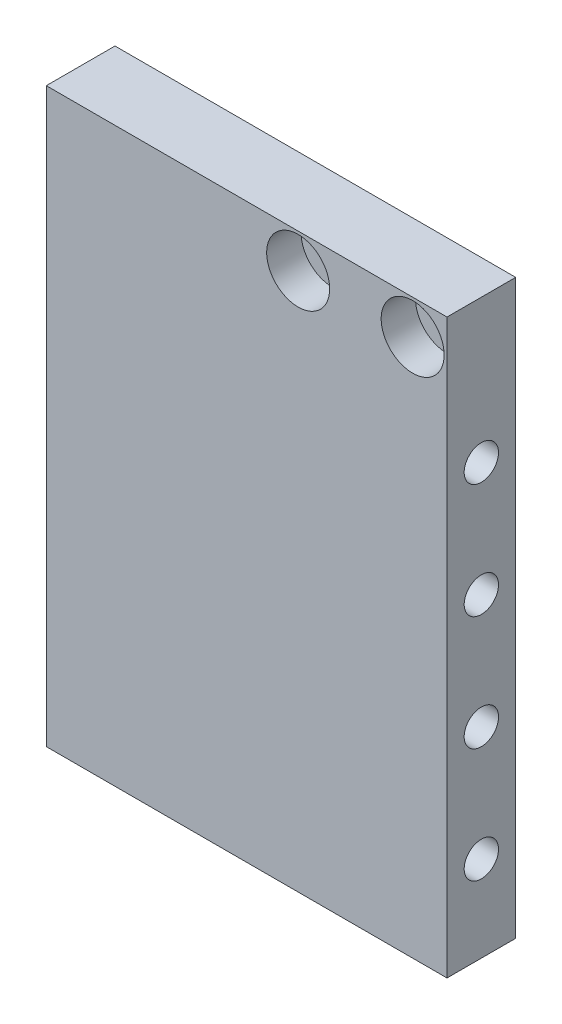
ISO-10303-21;
HEADER;
FILE_DESCRIPTION(('STEP AP214'),'2;1');
FILE_NAME('part.step','',(''),(''),'','','');
FILE_SCHEMA(('AUTOMOTIVE_DESIGN { 1 0 10303 214 1 1 1 1 }'));
ENDSEC;
DATA;
#1=APPLICATION_CONTEXT('core data for automotive mechanical design processes');
#2=APPLICATION_PROTOCOL_DEFINITION('international standard','automotive_design',2000,#1);
#3=PRODUCT_CONTEXT('',#1,'mechanical');
#4=PRODUCT('Part','Part','',(#3));
#5=PRODUCT_RELATED_PRODUCT_CATEGORY('part','',(#4));
#6=PRODUCT_DEFINITION_FORMATION('','',#4);
#7=PRODUCT_DEFINITION_CONTEXT('part definition',#1,'design');
#8=PRODUCT_DEFINITION('design','',#6,#7);
#9=PRODUCT_DEFINITION_SHAPE('','',#8);
#10=(LENGTH_UNIT() NAMED_UNIT(*) SI_UNIT(.MILLI.,.METRE.));
#11=(NAMED_UNIT(*) PLANE_ANGLE_UNIT() SI_UNIT($,.RADIAN.));
#12=(NAMED_UNIT(*) SI_UNIT($,.STERADIAN.) SOLID_ANGLE_UNIT());
#13=UNCERTAINTY_MEASURE_WITH_UNIT(LENGTH_MEASURE(1.E-05),#10,'distance_accuracy_value','');
#14=(GEOMETRIC_REPRESENTATION_CONTEXT(3) GLOBAL_UNCERTAINTY_ASSIGNED_CONTEXT((#13)) GLOBAL_UNIT_ASSIGNED_CONTEXT((#10,
#11,#12)) REPRESENTATION_CONTEXT('',''));
#15=CARTESIAN_POINT('',(0.,0.,0.));
#16=DIRECTION('',(0.,0.,1.));
#17=DIRECTION('',(1.,0.,0.));
#18=AXIS2_PLACEMENT_3D('',#15,#16,#17);
#19=CARTESIAN_POINT('',(29.,44.,0.));
#20=DIRECTION('',(0.,0.,1.));
#21=DIRECTION('',(1.,0.,0.));
#22=AXIS2_PLACEMENT_3D('',#19,#20,#21);
#23=CYLINDRICAL_SURFACE('',#22,3.);
#24=CARTESIAN_POINT('',(29.,44.,0.));
#25=DIRECTION('',(0.,0.,1.));
#26=DIRECTION('',(1.,0.,0.));
#27=AXIS2_PLACEMENT_3D('',#24,#25,#26);
#28=CIRCLE('',#27,3.);
#29=CARTESIAN_POINT('',(32.,44.,0.));
#30=VERTEX_POINT('',#29);
#31=EDGE_CURVE('E114',#30,#30,#28,.T.);
#32=ORIENTED_EDGE('',*,*,#31,.F.);
#33=EDGE_LOOP('',(#32));
#34=FACE_BOUND('',#33,.T.);
#35=CARTESIAN_POINT('',(29.,44.,6.));
#36=DIRECTION('',(0.,0.,1.));
#37=DIRECTION('',(1.,0.,0.));
#38=AXIS2_PLACEMENT_3D('',#35,#36,#37);
#39=CIRCLE('',#38,3.);
#40=CARTESIAN_POINT('',(32.,44.,6.));
#41=VERTEX_POINT('',#40);
#42=EDGE_CURVE('E37',#41,#41,#39,.F.);
#43=ORIENTED_EDGE('',*,*,#42,.F.);
#44=EDGE_LOOP('',(#43));
#45=FACE_BOUND('',#44,.T.);
#46=ADVANCED_FACE('F33',(#34,#45),#23,.F.);
#47=CARTESIAN_POINT('',(9.00000000000001,44.,0.));
#48=DIRECTION('',(0.,0.,1.));
#49=DIRECTION('',(1.,0.,0.));
#50=AXIS2_PLACEMENT_3D('',#47,#48,#49);
#51=CYLINDRICAL_SURFACE('',#50,3.);
#52=CARTESIAN_POINT('',(9.00000000000001,44.,0.));
#53=DIRECTION('',(0.,0.,1.));
#54=DIRECTION('',(1.,0.,0.));
#55=AXIS2_PLACEMENT_3D('',#52,#53,#54);
#56=CIRCLE('',#55,3.);
#57=CARTESIAN_POINT('',(12.,44.,0.));
#58=VERTEX_POINT('',#57);
#59=EDGE_CURVE('E133',#58,#58,#56,.T.);
#60=ORIENTED_EDGE('',*,*,#59,.F.);
#61=EDGE_LOOP('',(#60));
#62=FACE_BOUND('',#61,.T.);
#63=CARTESIAN_POINT('',(9.00000000000001,44.,6.));
#64=DIRECTION('',(0.,0.,1.));
#65=DIRECTION('',(1.,0.,0.));
#66=AXIS2_PLACEMENT_3D('',#63,#64,#65);
#67=CIRCLE('',#66,3.);
#68=CARTESIAN_POINT('',(12.,44.,6.));
#69=VERTEX_POINT('',#68);
#70=EDGE_CURVE('E108',#69,#69,#67,.F.);
#71=ORIENTED_EDGE('',*,*,#70,.F.);
#72=EDGE_LOOP('',(#71));
#73=FACE_BOUND('',#72,.T.);
#74=ADVANCED_FACE('F166',(#62,#73),#51,.F.);
#75=CARTESIAN_POINT('',(-35.,-50.,12.));
#76=DIRECTION('',(1.,0.,0.));
#77=DIRECTION('',(0.,0.,-1.));
#78=AXIS2_PLACEMENT_3D('',#75,#76,#77);
#79=PLANE('',#78);
#80=CARTESIAN_POINT('',(-35.,-35.,6.));
#81=DIRECTION('',(-1.,0.,0.));
#82=DIRECTION('',(0.,0.,1.));
#83=AXIS2_PLACEMENT_3D('',#80,#81,#82);
#84=CIRCLE('',#83,3.);
#85=CARTESIAN_POINT('',(-35.,-35.,9.));
#86=VERTEX_POINT('',#85);
#87=EDGE_CURVE('E141',#86,#86,#84,.T.);
#88=ORIENTED_EDGE('',*,*,#87,.F.);
#89=EDGE_LOOP('',(#88));
#90=FACE_BOUND('',#89,.T.);
#91=CARTESIAN_POINT('',(-35.,-15.,6.));
#92=DIRECTION('',(-1.,0.,0.));
#93=DIRECTION('',(0.,0.,1.));
#94=AXIS2_PLACEMENT_3D('',#91,#92,#93);
#95=CIRCLE('',#94,3.);
#96=CARTESIAN_POINT('',(-35.,-15.,9.));
#97=VERTEX_POINT('',#96);
#98=EDGE_CURVE('E147',#97,#97,#95,.T.);
#99=ORIENTED_EDGE('',*,*,#98,.F.);
#100=EDGE_LOOP('',(#99));
#101=FACE_BOUND('',#100,.T.);
#102=CARTESIAN_POINT('',(-35.,5.,6.));
#103=DIRECTION('',(-1.,0.,0.));
#104=DIRECTION('',(0.,0.,1.));
#105=AXIS2_PLACEMENT_3D('',#102,#103,#104);
#106=CIRCLE('',#105,3.);
#107=CARTESIAN_POINT('',(-35.,5.,9.));
#108=VERTEX_POINT('',#107);
#109=EDGE_CURVE('E153',#108,#108,#106,.T.);
#110=ORIENTED_EDGE('',*,*,#109,.F.);
#111=EDGE_LOOP('',(#110));
#112=FACE_BOUND('',#111,.T.);
#113=CARTESIAN_POINT('',(-35.,25.,6.));
#114=DIRECTION('',(-1.,0.,0.));
#115=DIRECTION('',(0.,0.,1.));
#116=AXIS2_PLACEMENT_3D('',#113,#114,#115);
#117=CIRCLE('',#116,3.);
#118=CARTESIAN_POINT('',(-35.,25.,9.));
#119=VERTEX_POINT('',#118);
#120=EDGE_CURVE('E136',#119,#119,#117,.T.);
#121=ORIENTED_EDGE('',*,*,#120,.F.);
#122=EDGE_LOOP('',(#121));
#123=FACE_BOUND('',#122,.T.);
#124=DIRECTION('',(0.,-1.,0.));
#125=VECTOR('',#124,1.);
#126=CARTESIAN_POINT('',(-35.,-50.,0.));
#127=LINE('',#126,#125);
#128=CARTESIAN_POINT('',(-35.,50.,0.));
#129=VERTEX_POINT('',#128);
#130=CARTESIAN_POINT('',(-35.,-50.,0.));
#131=VERTEX_POINT('',#130);
#132=EDGE_CURVE('E100',#129,#131,#127,.T.);
#133=ORIENTED_EDGE('',*,*,#132,.T.);
#134=DIRECTION('',(0.,0.,-1.));
#135=VECTOR('',#134,1.);
#136=CARTESIAN_POINT('',(-35.,-50.,12.));
#137=LINE('',#136,#135);
#138=CARTESIAN_POINT('',(-35.,-50.,12.));
#139=VERTEX_POINT('',#138);
#140=EDGE_CURVE('E11',#139,#131,#137,.T.);
#141=ORIENTED_EDGE('',*,*,#140,.F.);
#142=DIRECTION('',(0.,-1.,0.));
#143=VECTOR('',#142,1.);
#144=CARTESIAN_POINT('',(-35.,-50.,12.));
#145=LINE('',#144,#143);
#146=CARTESIAN_POINT('',(-35.,50.,12.));
#147=VERTEX_POINT('',#146);
#148=EDGE_CURVE('E87',#147,#139,#145,.T.);
#149=ORIENTED_EDGE('',*,*,#148,.F.);
#150=DIRECTION('',(0.,0.,-1.));
#151=VECTOR('',#150,1.);
#152=CARTESIAN_POINT('',(-35.,50.,12.));
#153=LINE('',#152,#151);
#154=EDGE_CURVE('E96',#147,#129,#153,.T.);
#155=ORIENTED_EDGE('',*,*,#154,.T.);
#156=EDGE_LOOP('',(#133,#141,#149,#155));
#157=FACE_BOUND('',#156,.T.);
#158=ADVANCED_FACE('F35',(#90,#101,#112,#123,#157),#79,.F.);
#159=CARTESIAN_POINT('',(35.,-50.,12.));
#160=DIRECTION('',(0.,1.,0.));
#161=DIRECTION('',(-1.,0.,0.));
#162=AXIS2_PLACEMENT_3D('',#159,#160,#161);
#163=PLANE('',#162);
#164=CARTESIAN_POINT('',(-21.,-50.,6.));
#165=DIRECTION('',(0.,-1.,0.));
#166=DIRECTION('',(1.,0.,0.));
#167=AXIS2_PLACEMENT_3D('',#164,#165,#166);
#168=CIRCLE('',#167,3.);
#169=CARTESIAN_POINT('',(-18.,-50.,6.));
#170=VERTEX_POINT('',#169);
#171=EDGE_CURVE('E521',#170,#170,#168,.T.);
#172=ORIENTED_EDGE('',*,*,#171,.F.);
#173=EDGE_LOOP('',(#172));
#174=FACE_BOUND('',#173,.T.);
#175=CARTESIAN_POINT('',(-7.,-50.,6.));
#176=DIRECTION('',(0.,-1.,0.));
#177=DIRECTION('',(1.,0.,0.));
#178=AXIS2_PLACEMENT_3D('',#175,#176,#177);
#179=CIRCLE('',#178,3.);
#180=CARTESIAN_POINT('',(-4.,-50.,6.));
#181=VERTEX_POINT('',#180);
#182=EDGE_CURVE('E525',#181,#181,#179,.T.);
#183=ORIENTED_EDGE('',*,*,#182,.F.);
#184=EDGE_LOOP('',(#183));
#185=FACE_BOUND('',#184,.T.);
#186=CARTESIAN_POINT('',(7.,-50.,6.));
#187=DIRECTION('',(0.,-1.,0.));
#188=DIRECTION('',(1.,0.,0.));
#189=AXIS2_PLACEMENT_3D('',#186,#187,#188);
#190=CIRCLE('',#189,3.);
#191=CARTESIAN_POINT('',(10.,-50.,6.));
#192=VERTEX_POINT('',#191);
#193=EDGE_CURVE('E529',#192,#192,#190,.T.);
#194=ORIENTED_EDGE('',*,*,#193,.F.);
#195=EDGE_LOOP('',(#194));
#196=FACE_BOUND('',#195,.T.);
#197=CARTESIAN_POINT('',(21.,-50.,6.));
#198=DIRECTION('',(0.,-1.,0.));
#199=DIRECTION('',(1.,0.,0.));
#200=AXIS2_PLACEMENT_3D('',#197,#198,#199);
#201=CIRCLE('',#200,3.);
#202=CARTESIAN_POINT('',(24.,-50.,6.));
#203=VERTEX_POINT('',#202);
#204=EDGE_CURVE('E532',#203,#203,#201,.T.);
#205=ORIENTED_EDGE('',*,*,#204,.F.);
#206=EDGE_LOOP('',(#205));
#207=FACE_BOUND('',#206,.T.);
#208=DIRECTION('',(1.,0.,0.));
#209=VECTOR('',#208,1.);
#210=CARTESIAN_POINT('',(35.,-50.,0.));
#211=LINE('',#210,#209);
#212=CARTESIAN_POINT('',(35.,-50.,0.));
#213=VERTEX_POINT('',#212);
#214=EDGE_CURVE('E91',#131,#213,#211,.T.);
#215=ORIENTED_EDGE('',*,*,#214,.T.);
#216=DIRECTION('',(0.,0.,-1.));
#217=VECTOR('',#216,1.);
#218=CARTESIAN_POINT('',(35.,-50.,12.));
#219=LINE('',#218,#217);
#220=CARTESIAN_POINT('',(35.,-50.,12.));
#221=VERTEX_POINT('',#220);
#222=EDGE_CURVE('E43',#221,#213,#219,.T.);
#223=ORIENTED_EDGE('',*,*,#222,.F.);
#224=DIRECTION('',(1.,0.,0.));
#225=VECTOR('',#224,1.);
#226=CARTESIAN_POINT('',(35.,-50.,12.));
#227=LINE('',#226,#225);
#228=EDGE_CURVE('E82',#139,#221,#227,.T.);
#229=ORIENTED_EDGE('',*,*,#228,.F.);
#230=ORIENTED_EDGE('',*,*,#140,.T.);
#231=EDGE_LOOP('',(#215,#223,#229,#230));
#232=FACE_BOUND('',#231,.T.);
#233=ADVANCED_FACE('F90',(#174,#185,#196,#207,#232),#163,.F.);
#234=CARTESIAN_POINT('',(35.,-50.,12.));
#235=DIRECTION('',(-1.,0.,0.));
#236=DIRECTION('',(0.,0.,1.));
#237=AXIS2_PLACEMENT_3D('',#234,#235,#236);
#238=PLANE('',#237);
#239=CARTESIAN_POINT('',(35.,-35.,6.));
#240=DIRECTION('',(1.,0.,0.));
#241=DIRECTION('',(0.,0.,-1.));
#242=AXIS2_PLACEMENT_3D('',#239,#240,#241);
#243=CIRCLE('',#242,3.);
#244=CARTESIAN_POINT('',(35.,-35.,3.));
#245=VERTEX_POINT('',#244);
#246=EDGE_CURVE('E542',#245,#245,#243,.T.);
#247=ORIENTED_EDGE('',*,*,#246,.F.);
#248=EDGE_LOOP('',(#247));
#249=FACE_BOUND('',#248,.T.);
#250=CARTESIAN_POINT('',(35.,-15.,6.00000000000007));
#251=DIRECTION('',(1.,0.,0.));
#252=DIRECTION('',(0.,0.,-1.));
#253=AXIS2_PLACEMENT_3D('',#250,#251,#252);
#254=CIRCLE('',#253,3.);
#255=CARTESIAN_POINT('',(35.,-15.,3.00000000000007));
#256=VERTEX_POINT('',#255);
#257=EDGE_CURVE('E548',#256,#256,#254,.T.);
#258=ORIENTED_EDGE('',*,*,#257,.F.);
#259=EDGE_LOOP('',(#258));
#260=FACE_BOUND('',#259,.T.);
#261=CARTESIAN_POINT('',(35.,5.00000000000001,6.00000000000014));
#262=DIRECTION('',(1.,0.,0.));
#263=DIRECTION('',(0.,0.,-1.));
#264=AXIS2_PLACEMENT_3D('',#261,#262,#263);
#265=CIRCLE('',#264,3.);
#266=CARTESIAN_POINT('',(35.,5.00000000000001,3.00000000000014));
#267=VERTEX_POINT('',#266);
#268=EDGE_CURVE('E554',#267,#267,#265,.T.);
#269=ORIENTED_EDGE('',*,*,#268,.F.);
#270=EDGE_LOOP('',(#269));
#271=FACE_BOUND('',#270,.T.);
#272=CARTESIAN_POINT('',(35.,25.,6.00000000000021));
#273=DIRECTION('',(1.,0.,0.));
#274=DIRECTION('',(0.,0.,-1.));
#275=AXIS2_PLACEMENT_3D('',#272,#273,#274);
#276=CIRCLE('',#275,3.);
#277=CARTESIAN_POINT('',(35.,25.,3.0000000000002));
#278=VERTEX_POINT('',#277);
#279=EDGE_CURVE('E124',#278,#278,#276,.T.);
#280=ORIENTED_EDGE('',*,*,#279,.F.);
#281=EDGE_LOOP('',(#280));
#282=FACE_BOUND('',#281,.T.);
#283=DIRECTION('',(0.,1.,0.));
#284=VECTOR('',#283,1.);
#285=CARTESIAN_POINT('',(35.,-50.,0.));
#286=LINE('',#285,#284);
#287=CARTESIAN_POINT('',(35.,50.,0.));
#288=VERTEX_POINT('',#287);
#289=EDGE_CURVE('E69',#213,#288,#286,.T.);
#290=ORIENTED_EDGE('',*,*,#289,.T.);
#291=DIRECTION('',(0.,0.,-1.));
#292=VECTOR('',#291,1.);
#293=CARTESIAN_POINT('',(35.,50.,12.));
#294=LINE('',#293,#292);
#295=CARTESIAN_POINT('',(35.,50.,12.));
#296=VERTEX_POINT('',#295);
#297=EDGE_CURVE('E92',#296,#288,#294,.T.);
#298=ORIENTED_EDGE('',*,*,#297,.F.);
#299=DIRECTION('',(0.,1.,0.));
#300=VECTOR('',#299,1.);
#301=CARTESIAN_POINT('',(35.,-50.,12.));
#302=LINE('',#301,#300);
#303=EDGE_CURVE('E85',#221,#296,#302,.T.);
#304=ORIENTED_EDGE('',*,*,#303,.F.);
#305=ORIENTED_EDGE('',*,*,#222,.T.);
#306=EDGE_LOOP('',(#290,#298,#304,#305));
#307=FACE_BOUND('',#306,.T.);
#308=ADVANCED_FACE('F94',(#249,#260,#271,#282,#307),#238,.F.);
#309=CARTESIAN_POINT('',(35.,50.,12.));
#310=DIRECTION('',(0.,-1.,0.));
#311=DIRECTION('',(1.,0.,0.));
#312=AXIS2_PLACEMENT_3D('',#309,#310,#311);
#313=PLANE('',#312);
#314=DIRECTION('',(-1.,0.,0.));
#315=VECTOR('',#314,1.);
#316=CARTESIAN_POINT('',(35.,50.,0.));
#317=LINE('',#316,#315);
#318=EDGE_CURVE('E75',#288,#129,#317,.T.);
#319=ORIENTED_EDGE('',*,*,#318,.T.);
#320=ORIENTED_EDGE('',*,*,#154,.F.);
#321=DIRECTION('',(-1.,0.,0.));
#322=VECTOR('',#321,1.);
#323=CARTESIAN_POINT('',(35.,50.,12.));
#324=LINE('',#323,#322);
#325=EDGE_CURVE('E52',#296,#147,#324,.T.);
#326=ORIENTED_EDGE('',*,*,#325,.F.);
#327=ORIENTED_EDGE('',*,*,#297,.T.);
#328=EDGE_LOOP('',(#319,#320,#326,#327));
#329=FACE_BOUND('',#328,.T.);
#330=ADVANCED_FACE('F181',(#329),#313,.F.);
#331=CARTESIAN_POINT('',(0.,0.,12.));
#332=DIRECTION('',(0.,0.,1.));
#333=DIRECTION('',(1.,0.,0.));
#334=AXIS2_PLACEMENT_3D('',#331,#332,#333);
#335=PLANE('',#334);
#336=CARTESIAN_POINT('',(9.00000000000001,44.,12.));
#337=DIRECTION('',(0.,0.,1.));
#338=DIRECTION('',(1.,0.,0.));
#339=AXIS2_PLACEMENT_3D('',#336,#337,#338);
#340=CIRCLE('',#339,5.5);
#341=CARTESIAN_POINT('',(14.5,44.,12.));
#342=VERTEX_POINT('',#341);
#343=EDGE_CURVE('E116',#342,#342,#340,.T.);
#344=ORIENTED_EDGE('',*,*,#343,.F.);
#345=EDGE_LOOP('',(#344));
#346=FACE_BOUND('',#345,.T.);
#347=CARTESIAN_POINT('',(29.,44.,12.));
#348=DIRECTION('',(0.,0.,1.));
#349=DIRECTION('',(1.,0.,0.));
#350=AXIS2_PLACEMENT_3D('',#347,#348,#349);
#351=CIRCLE('',#350,5.5);
#352=CARTESIAN_POINT('',(34.5,44.,12.));
#353=VERTEX_POINT('',#352);
#354=EDGE_CURVE('E129',#353,#353,#351,.T.);
#355=ORIENTED_EDGE('',*,*,#354,.F.);
#356=EDGE_LOOP('',(#355));
#357=FACE_BOUND('',#356,.T.);
#358=ORIENTED_EDGE('',*,*,#148,.T.);
#359=ORIENTED_EDGE('',*,*,#228,.T.);
#360=ORIENTED_EDGE('',*,*,#303,.T.);
#361=ORIENTED_EDGE('',*,*,#325,.T.);
#362=EDGE_LOOP('',(#358,#359,#360,#361));
#363=FACE_BOUND('',#362,.T.);
#364=ADVANCED_FACE('F83',(#346,#357,#363),#335,.T.);
#365=CARTESIAN_POINT('',(0.,0.,0.));
#366=DIRECTION('',(0.,0.,1.));
#367=DIRECTION('',(1.,0.,0.));
#368=AXIS2_PLACEMENT_3D('',#365,#366,#367);
#369=PLANE('',#368);
#370=ORIENTED_EDGE('',*,*,#59,.T.);
#371=EDGE_LOOP('',(#370));
#372=FACE_BOUND('',#371,.T.);
#373=ORIENTED_EDGE('',*,*,#31,.T.);
#374=EDGE_LOOP('',(#373));
#375=FACE_BOUND('',#374,.T.);
#376=ORIENTED_EDGE('',*,*,#132,.F.);
#377=ORIENTED_EDGE('',*,*,#318,.F.);
#378=ORIENTED_EDGE('',*,*,#289,.F.);
#379=ORIENTED_EDGE('',*,*,#214,.F.);
#380=EDGE_LOOP('',(#376,#377,#378,#379));
#381=FACE_BOUND('',#380,.T.);
#382=ADVANCED_FACE('F170',(#372,#375,#381),#369,.F.);
#383=CARTESIAN_POINT('',(-25.,25.,6.));
#384=DIRECTION('',(-1.,0.,0.));
#385=DIRECTION('',(0.,0.,1.));
#386=AXIS2_PLACEMENT_3D('',#383,#384,#385);
#387=CYLINDRICAL_SURFACE('',#386,3.);
#388=CARTESIAN_POINT('',(-25.,25.,6.));
#389=DIRECTION('',(-1.,0.,0.));
#390=DIRECTION('',(0.,0.,1.));
#391=AXIS2_PLACEMENT_3D('',#388,#389,#390);
#392=CIRCLE('',#391,3.);
#393=CARTESIAN_POINT('',(-25.,25.,9.));
#394=VERTEX_POINT('',#393);
#395=EDGE_CURVE('E156',#394,#394,#392,.T.);
#396=ORIENTED_EDGE('',*,*,#395,.F.);
#397=EDGE_LOOP('',(#396));
#398=FACE_BOUND('',#397,.T.);
#399=ORIENTED_EDGE('',*,*,#120,.T.);
#400=EDGE_LOOP('',(#399));
#401=FACE_BOUND('',#400,.T.);
#402=ADVANCED_FACE('F162',(#398,#401),#387,.F.);
#403=CARTESIAN_POINT('',(-25.,25.,6.));
#404=DIRECTION('',(-1.,0.,0.));
#405=DIRECTION('',(0.,0.,1.));
#406=AXIS2_PLACEMENT_3D('',#403,#404,#405);
#407=PLANE('',#406);
#408=ORIENTED_EDGE('',*,*,#395,.T.);
#409=EDGE_LOOP('',(#408));
#410=FACE_BOUND('',#409,.T.);
#411=ADVANCED_FACE('F178',(#410),#407,.T.);
#412=CARTESIAN_POINT('',(-25.,5.,6.));
#413=DIRECTION('',(-1.,0.,0.));
#414=DIRECTION('',(0.,0.,1.));
#415=AXIS2_PLACEMENT_3D('',#412,#413,#414);
#416=CYLINDRICAL_SURFACE('',#415,3.);
#417=CARTESIAN_POINT('',(-25.,5.,6.));
#418=DIRECTION('',(-1.,0.,0.));
#419=DIRECTION('',(0.,0.,1.));
#420=AXIS2_PLACEMENT_3D('',#417,#418,#419);
#421=CIRCLE('',#420,3.);
#422=CARTESIAN_POINT('',(-25.,5.,9.));
#423=VERTEX_POINT('',#422);
#424=EDGE_CURVE('E150',#423,#423,#421,.T.);
#425=ORIENTED_EDGE('',*,*,#424,.F.);
#426=EDGE_LOOP('',(#425));
#427=FACE_BOUND('',#426,.T.);
#428=ORIENTED_EDGE('',*,*,#109,.T.);
#429=EDGE_LOOP('',(#428));
#430=FACE_BOUND('',#429,.T.);
#431=ADVANCED_FACE('F218',(#427,#430),#416,.F.);
#432=CARTESIAN_POINT('',(-25.,5.,6.));
#433=DIRECTION('',(-1.,0.,0.));
#434=DIRECTION('',(0.,0.,1.));
#435=AXIS2_PLACEMENT_3D('',#432,#433,#434);
#436=PLANE('',#435);
#437=ORIENTED_EDGE('',*,*,#424,.T.);
#438=EDGE_LOOP('',(#437));
#439=FACE_BOUND('',#438,.T.);
#440=ADVANCED_FACE('F214',(#439),#436,.T.);
#441=CARTESIAN_POINT('',(-25.,-15.,6.));
#442=DIRECTION('',(-1.,0.,0.));
#443=DIRECTION('',(0.,0.,1.));
#444=AXIS2_PLACEMENT_3D('',#441,#442,#443);
#445=CYLINDRICAL_SURFACE('',#444,3.);
#446=CARTESIAN_POINT('',(-25.,-15.,6.));
#447=DIRECTION('',(-1.,0.,0.));
#448=DIRECTION('',(0.,0.,1.));
#449=AXIS2_PLACEMENT_3D('',#446,#447,#448);
#450=CIRCLE('',#449,3.);
#451=CARTESIAN_POINT('',(-25.,-15.,9.));
#452=VERTEX_POINT('',#451);
#453=EDGE_CURVE('E144',#452,#452,#450,.T.);
#454=ORIENTED_EDGE('',*,*,#453,.F.);
#455=EDGE_LOOP('',(#454));
#456=FACE_BOUND('',#455,.T.);
#457=ORIENTED_EDGE('',*,*,#98,.T.);
#458=EDGE_LOOP('',(#457));
#459=FACE_BOUND('',#458,.T.);
#460=ADVANCED_FACE('F210',(#456,#459),#445,.F.);
#461=CARTESIAN_POINT('',(-25.,-15.,6.));
#462=DIRECTION('',(-1.,0.,0.));
#463=DIRECTION('',(0.,0.,1.));
#464=AXIS2_PLACEMENT_3D('',#461,#462,#463);
#465=PLANE('',#464);
#466=ORIENTED_EDGE('',*,*,#453,.T.);
#467=EDGE_LOOP('',(#466));
#468=FACE_BOUND('',#467,.T.);
#469=ADVANCED_FACE('F206',(#468),#465,.T.);
#470=CARTESIAN_POINT('',(-25.,-35.,6.));
#471=DIRECTION('',(-1.,0.,0.));
#472=DIRECTION('',(0.,0.,1.));
#473=AXIS2_PLACEMENT_3D('',#470,#471,#472);
#474=CYLINDRICAL_SURFACE('',#473,3.);
#475=CARTESIAN_POINT('',(-25.,-35.,6.));
#476=DIRECTION('',(-1.,0.,0.));
#477=DIRECTION('',(0.,0.,1.));
#478=AXIS2_PLACEMENT_3D('',#475,#476,#477);
#479=CIRCLE('',#478,3.);
#480=CARTESIAN_POINT('',(-25.,-35.,9.));
#481=VERTEX_POINT('',#480);
#482=EDGE_CURVE('E103',#481,#481,#479,.T.);
#483=ORIENTED_EDGE('',*,*,#482,.F.);
#484=EDGE_LOOP('',(#483));
#485=FACE_BOUND('',#484,.T.);
#486=ORIENTED_EDGE('',*,*,#87,.T.);
#487=EDGE_LOOP('',(#486));
#488=FACE_BOUND('',#487,.T.);
#489=ADVANCED_FACE('F202',(#485,#488),#474,.F.);
#490=CARTESIAN_POINT('',(-25.,-35.,6.));
#491=DIRECTION('',(-1.,0.,0.));
#492=DIRECTION('',(0.,0.,1.));
#493=AXIS2_PLACEMENT_3D('',#490,#491,#492);
#494=PLANE('',#493);
#495=ORIENTED_EDGE('',*,*,#482,.T.);
#496=EDGE_LOOP('',(#495));
#497=FACE_BOUND('',#496,.T.);
#498=ADVANCED_FACE('F198',(#497),#494,.T.);
#499=CARTESIAN_POINT('',(9.00000000000001,44.,6.));
#500=DIRECTION('',(0.,0.,1.));
#501=DIRECTION('',(1.,0.,0.));
#502=AXIS2_PLACEMENT_3D('',#499,#500,#501);
#503=PLANE('',#502);
#504=CARTESIAN_POINT('',(9.00000000000001,44.,6.));
#505=DIRECTION('',(0.,0.,1.));
#506=DIRECTION('',(1.,0.,0.));
#507=AXIS2_PLACEMENT_3D('',#504,#505,#506);
#508=CIRCLE('',#507,5.5);
#509=CARTESIAN_POINT('',(14.5,44.,6.));
#510=VERTEX_POINT('',#509);
#511=EDGE_CURVE('E110',#510,#510,#508,.T.);
#512=ORIENTED_EDGE('',*,*,#511,.T.);
#513=EDGE_LOOP('',(#512));
#514=FACE_BOUND('',#513,.T.);
#515=ORIENTED_EDGE('',*,*,#70,.T.);
#516=EDGE_LOOP('',(#515));
#517=FACE_BOUND('',#516,.T.);
#518=ADVANCED_FACE('F201',(#514,#517),#503,.T.);
#519=CARTESIAN_POINT('',(9.00000000000001,44.,6.));
#520=DIRECTION('',(0.,0.,1.));
#521=DIRECTION('',(1.,0.,0.));
#522=AXIS2_PLACEMENT_3D('',#519,#520,#521);
#523=CYLINDRICAL_SURFACE('',#522,5.5);
#524=ORIENTED_EDGE('',*,*,#511,.F.);
#525=EDGE_LOOP('',(#524));
#526=FACE_BOUND('',#525,.T.);
#527=ORIENTED_EDGE('',*,*,#343,.T.);
#528=EDGE_LOOP('',(#527));
#529=FACE_BOUND('',#528,.T.);
#530=ADVANCED_FACE('F260',(#526,#529),#523,.F.);
#531=CARTESIAN_POINT('',(29.,44.,6.));
#532=DIRECTION('',(0.,0.,1.));
#533=DIRECTION('',(1.,0.,0.));
#534=AXIS2_PLACEMENT_3D('',#531,#532,#533);
#535=PLANE('',#534);
#536=CARTESIAN_POINT('',(29.,44.,6.));
#537=DIRECTION('',(0.,0.,1.));
#538=DIRECTION('',(1.,0.,0.));
#539=AXIS2_PLACEMENT_3D('',#536,#537,#538);
#540=CIRCLE('',#539,5.5);
#541=CARTESIAN_POINT('',(34.5,44.,6.));
#542=VERTEX_POINT('',#541);
#543=EDGE_CURVE('E121',#542,#542,#540,.T.);
#544=ORIENTED_EDGE('',*,*,#543,.T.);
#545=EDGE_LOOP('',(#544));
#546=FACE_BOUND('',#545,.T.);
#547=ORIENTED_EDGE('',*,*,#42,.T.);
#548=EDGE_LOOP('',(#547));
#549=FACE_BOUND('',#548,.T.);
#550=ADVANCED_FACE('F268',(#546,#549),#535,.T.);
#551=CARTESIAN_POINT('',(29.,44.,6.));
#552=DIRECTION('',(0.,0.,1.));
#553=DIRECTION('',(1.,0.,0.));
#554=AXIS2_PLACEMENT_3D('',#551,#552,#553);
#555=CYLINDRICAL_SURFACE('',#554,5.5);
#556=ORIENTED_EDGE('',*,*,#543,.F.);
#557=EDGE_LOOP('',(#556));
#558=FACE_BOUND('',#557,.T.);
#559=ORIENTED_EDGE('',*,*,#354,.T.);
#560=EDGE_LOOP('',(#559));
#561=FACE_BOUND('',#560,.T.);
#562=ADVANCED_FACE('F276',(#558,#561),#555,.F.);
#563=CARTESIAN_POINT('',(25.,25.,6.00000000000021));
#564=DIRECTION('',(1.,0.,0.));
#565=DIRECTION('',(0.,0.,-1.));
#566=AXIS2_PLACEMENT_3D('',#563,#564,#565);
#567=CYLINDRICAL_SURFACE('',#566,3.);
#568=CARTESIAN_POINT('',(25.,25.,6.00000000000021));
#569=DIRECTION('',(1.,0.,0.));
#570=DIRECTION('',(0.,0.,-1.));
#571=AXIS2_PLACEMENT_3D('',#568,#569,#570);
#572=CIRCLE('',#571,3.);
#573=CARTESIAN_POINT('',(25.,25.,3.0000000000002));
#574=VERTEX_POINT('',#573);
#575=EDGE_CURVE('E556',#574,#574,#572,.T.);
#576=ORIENTED_EDGE('',*,*,#575,.F.);
#577=EDGE_LOOP('',(#576));
#578=FACE_BOUND('',#577,.T.);
#579=ORIENTED_EDGE('',*,*,#279,.T.);
#580=EDGE_LOOP('',(#579));
#581=FACE_BOUND('',#580,.T.);
#582=ADVANCED_FACE('F284',(#578,#581),#567,.F.);
#583=CARTESIAN_POINT('',(25.,25.,6.00000000000021));
#584=DIRECTION('',(1.,0.,0.));
#585=DIRECTION('',(0.,0.,-1.));
#586=AXIS2_PLACEMENT_3D('',#583,#584,#585);
#587=PLANE('',#586);
#588=ORIENTED_EDGE('',*,*,#575,.T.);
#589=EDGE_LOOP('',(#588));
#590=FACE_BOUND('',#589,.T.);
#591=ADVANCED_FACE('F292',(#590),#587,.T.);
#592=CARTESIAN_POINT('',(25.,5.00000000000001,6.00000000000014));
#593=DIRECTION('',(1.,0.,0.));
#594=DIRECTION('',(0.,0.,-1.));
#595=AXIS2_PLACEMENT_3D('',#592,#593,#594);
#596=CYLINDRICAL_SURFACE('',#595,3.);
#597=CARTESIAN_POINT('',(25.,5.00000000000001,6.00000000000014));
#598=DIRECTION('',(1.,0.,0.));
#599=DIRECTION('',(0.,0.,-1.));
#600=AXIS2_PLACEMENT_3D('',#597,#598,#599);
#601=CIRCLE('',#600,3.);
#602=CARTESIAN_POINT('',(25.,5.00000000000001,3.00000000000014));
#603=VERTEX_POINT('',#602);
#604=EDGE_CURVE('E551',#603,#603,#601,.T.);
#605=ORIENTED_EDGE('',*,*,#604,.F.);
#606=EDGE_LOOP('',(#605));
#607=FACE_BOUND('',#606,.T.);
#608=ORIENTED_EDGE('',*,*,#268,.T.);
#609=EDGE_LOOP('',(#608));
#610=FACE_BOUND('',#609,.T.);
#611=ADVANCED_FACE('F300',(#607,#610),#596,.F.);
#612=CARTESIAN_POINT('',(25.,5.00000000000001,6.00000000000014));
#613=DIRECTION('',(1.,0.,0.));
#614=DIRECTION('',(0.,0.,-1.));
#615=AXIS2_PLACEMENT_3D('',#612,#613,#614);
#616=PLANE('',#615);
#617=ORIENTED_EDGE('',*,*,#604,.T.);
#618=EDGE_LOOP('',(#617));
#619=FACE_BOUND('',#618,.T.);
#620=ADVANCED_FACE('F308',(#619),#616,.T.);
#621=CARTESIAN_POINT('',(25.,-15.,6.00000000000007));
#622=DIRECTION('',(1.,0.,0.));
#623=DIRECTION('',(0.,0.,-1.));
#624=AXIS2_PLACEMENT_3D('',#621,#622,#623);
#625=CYLINDRICAL_SURFACE('',#624,3.);
#626=CARTESIAN_POINT('',(25.,-15.,6.00000000000007));
#627=DIRECTION('',(1.,0.,0.));
#628=DIRECTION('',(0.,0.,-1.));
#629=AXIS2_PLACEMENT_3D('',#626,#627,#628);
#630=CIRCLE('',#629,3.);
#631=CARTESIAN_POINT('',(25.,-15.,3.00000000000007));
#632=VERTEX_POINT('',#631);
#633=EDGE_CURVE('E545',#632,#632,#630,.T.);
#634=ORIENTED_EDGE('',*,*,#633,.F.);
#635=EDGE_LOOP('',(#634));
#636=FACE_BOUND('',#635,.T.);
#637=ORIENTED_EDGE('',*,*,#257,.T.);
#638=EDGE_LOOP('',(#637));
#639=FACE_BOUND('',#638,.T.);
#640=ADVANCED_FACE('F316',(#636,#639),#625,.F.);
#641=CARTESIAN_POINT('',(25.,-15.,6.00000000000007));
#642=DIRECTION('',(1.,0.,0.));
#643=DIRECTION('',(0.,0.,-1.));
#644=AXIS2_PLACEMENT_3D('',#641,#642,#643);
#645=PLANE('',#644);
#646=ORIENTED_EDGE('',*,*,#633,.T.);
#647=EDGE_LOOP('',(#646));
#648=FACE_BOUND('',#647,.T.);
#649=ADVANCED_FACE('F324',(#648),#645,.T.);
#650=CARTESIAN_POINT('',(25.,-35.,6.));
#651=DIRECTION('',(1.,0.,0.));
#652=DIRECTION('',(0.,0.,-1.));
#653=AXIS2_PLACEMENT_3D('',#650,#651,#652);
#654=CYLINDRICAL_SURFACE('',#653,3.);
#655=CARTESIAN_POINT('',(25.,-35.,6.));
#656=DIRECTION('',(1.,0.,0.));
#657=DIRECTION('',(0.,0.,-1.));
#658=AXIS2_PLACEMENT_3D('',#655,#656,#657);
#659=CIRCLE('',#658,3.);
#660=CARTESIAN_POINT('',(25.,-35.,3.));
#661=VERTEX_POINT('',#660);
#662=EDGE_CURVE('E132',#661,#661,#659,.T.);
#663=ORIENTED_EDGE('',*,*,#662,.F.);
#664=EDGE_LOOP('',(#663));
#665=FACE_BOUND('',#664,.T.);
#666=ORIENTED_EDGE('',*,*,#246,.T.);
#667=EDGE_LOOP('',(#666));
#668=FACE_BOUND('',#667,.T.);
#669=ADVANCED_FACE('F332',(#665,#668),#654,.F.);
#670=CARTESIAN_POINT('',(25.,-35.,6.));
#671=DIRECTION('',(1.,0.,0.));
#672=DIRECTION('',(0.,0.,-1.));
#673=AXIS2_PLACEMENT_3D('',#670,#671,#672);
#674=PLANE('',#673);
#675=ORIENTED_EDGE('',*,*,#662,.T.);
#676=EDGE_LOOP('',(#675));
#677=FACE_BOUND('',#676,.T.);
#678=ADVANCED_FACE('F340',(#677),#674,.T.);
#679=CARTESIAN_POINT('',(21.,-40.,6.));
#680=DIRECTION('',(0.,-1.,0.));
#681=DIRECTION('',(1.,0.,0.));
#682=AXIS2_PLACEMENT_3D('',#679,#680,#681);
#683=CYLINDRICAL_SURFACE('',#682,3.);
#684=CARTESIAN_POINT('',(21.,-40.,6.));
#685=DIRECTION('',(0.,-1.,0.));
#686=DIRECTION('',(1.,0.,0.));
#687=AXIS2_PLACEMENT_3D('',#684,#685,#686);
#688=CIRCLE('',#687,3.);
#689=CARTESIAN_POINT('',(24.,-40.,6.));
#690=VERTEX_POINT('',#689);
#691=EDGE_CURVE('E534',#690,#690,#688,.T.);
#692=ORIENTED_EDGE('',*,*,#691,.F.);
#693=EDGE_LOOP('',(#692));
#694=FACE_BOUND('',#693,.T.);
#695=ORIENTED_EDGE('',*,*,#204,.T.);
#696=EDGE_LOOP('',(#695));
#697=FACE_BOUND('',#696,.T.);
#698=ADVANCED_FACE('F348',(#694,#697),#683,.F.);
#699=CARTESIAN_POINT('',(21.,-40.,6.));
#700=DIRECTION('',(0.,-1.,0.));
#701=DIRECTION('',(1.,0.,0.));
#702=AXIS2_PLACEMENT_3D('',#699,#700,#701);
#703=PLANE('',#702);
#704=ORIENTED_EDGE('',*,*,#691,.T.);
#705=EDGE_LOOP('',(#704));
#706=FACE_BOUND('',#705,.T.);
#707=ADVANCED_FACE('F357',(#706),#703,.T.);
#708=CARTESIAN_POINT('',(7.,-40.,6.));
#709=DIRECTION('',(0.,-1.,0.));
#710=DIRECTION('',(1.,0.,0.));
#711=AXIS2_PLACEMENT_3D('',#708,#709,#710);
#712=CYLINDRICAL_SURFACE('',#711,3.);
#713=CARTESIAN_POINT('',(7.,-40.,6.));
#714=DIRECTION('',(0.,-1.,0.));
#715=DIRECTION('',(1.,0.,0.));
#716=AXIS2_PLACEMENT_3D('',#713,#714,#715);
#717=CIRCLE('',#716,3.);
#718=CARTESIAN_POINT('',(10.,-40.,6.));
#719=VERTEX_POINT('',#718);
#720=EDGE_CURVE('E572',#719,#719,#717,.T.);
#721=ORIENTED_EDGE('',*,*,#720,.F.);
#722=EDGE_LOOP('',(#721));
#723=FACE_BOUND('',#722,.T.);
#724=ORIENTED_EDGE('',*,*,#193,.T.);
#725=EDGE_LOOP('',(#724));
#726=FACE_BOUND('',#725,.T.);
#727=ADVANCED_FACE('F365',(#723,#726),#712,.F.);
#728=CARTESIAN_POINT('',(7.,-40.,6.));
#729=DIRECTION('',(0.,-1.,0.));
#730=DIRECTION('',(1.,0.,0.));
#731=AXIS2_PLACEMENT_3D('',#728,#729,#730);
#732=PLANE('',#731);
#733=ORIENTED_EDGE('',*,*,#720,.T.);
#734=EDGE_LOOP('',(#733));
#735=FACE_BOUND('',#734,.T.);
#736=ADVANCED_FACE('F373',(#735),#732,.T.);
#737=CARTESIAN_POINT('',(-7.,-40.,6.));
#738=DIRECTION('',(0.,-1.,0.));
#739=DIRECTION('',(1.,0.,0.));
#740=AXIS2_PLACEMENT_3D('',#737,#738,#739);
#741=CYLINDRICAL_SURFACE('',#740,3.);
#742=CARTESIAN_POINT('',(-7.,-40.,6.));
#743=DIRECTION('',(0.,-1.,0.));
#744=DIRECTION('',(1.,0.,0.));
#745=AXIS2_PLACEMENT_3D('',#742,#743,#744);
#746=CIRCLE('',#745,3.);
#747=CARTESIAN_POINT('',(-4.,-40.,6.));
#748=VERTEX_POINT('',#747);
#749=EDGE_CURVE('E566',#748,#748,#746,.T.);
#750=ORIENTED_EDGE('',*,*,#749,.F.);
#751=EDGE_LOOP('',(#750));
#752=FACE_BOUND('',#751,.T.);
#753=ORIENTED_EDGE('',*,*,#182,.T.);
#754=EDGE_LOOP('',(#753));
#755=FACE_BOUND('',#754,.T.);
#756=ADVANCED_FACE('F381',(#752,#755),#741,.F.);
#757=CARTESIAN_POINT('',(-7.,-40.,6.));
#758=DIRECTION('',(0.,-1.,0.));
#759=DIRECTION('',(1.,0.,0.));
#760=AXIS2_PLACEMENT_3D('',#757,#758,#759);
#761=PLANE('',#760);
#762=ORIENTED_EDGE('',*,*,#749,.T.);
#763=EDGE_LOOP('',(#762));
#764=FACE_BOUND('',#763,.T.);
#765=ADVANCED_FACE('F389',(#764),#761,.T.);
#766=CARTESIAN_POINT('',(-21.,-40.,6.));
#767=DIRECTION('',(0.,-1.,0.));
#768=DIRECTION('',(1.,0.,0.));
#769=AXIS2_PLACEMENT_3D('',#766,#767,#768);
#770=CYLINDRICAL_SURFACE('',#769,3.);
#771=CARTESIAN_POINT('',(-21.,-40.,6.));
#772=DIRECTION('',(0.,-1.,0.));
#773=DIRECTION('',(1.,0.,0.));
#774=AXIS2_PLACEMENT_3D('',#771,#772,#773);
#775=CIRCLE('',#774,3.);
#776=CARTESIAN_POINT('',(-18.,-40.,6.));
#777=VERTEX_POINT('',#776);
#778=EDGE_CURVE('E560',#777,#777,#775,.T.);
#779=ORIENTED_EDGE('',*,*,#778,.F.);
#780=EDGE_LOOP('',(#779));
#781=FACE_BOUND('',#780,.T.);
#782=ORIENTED_EDGE('',*,*,#171,.T.);
#783=EDGE_LOOP('',(#782));
#784=FACE_BOUND('',#783,.T.);
#785=ADVANCED_FACE('F397',(#781,#784),#770,.F.);
#786=CARTESIAN_POINT('',(-21.,-40.,6.));
#787=DIRECTION('',(0.,-1.,0.));
#788=DIRECTION('',(1.,0.,0.));
#789=AXIS2_PLACEMENT_3D('',#786,#787,#788);
#790=PLANE('',#789);
#791=ORIENTED_EDGE('',*,*,#778,.T.);
#792=EDGE_LOOP('',(#791));
#793=FACE_BOUND('',#792,.T.);
#794=ADVANCED_FACE('F405',(#793),#790,.T.);
#795=CLOSED_SHELL('',(#46,#74,#158,#233,#308,#330,#364,#382,#402,#411,#431,#440,#460,#469,#489,
#498,#518,#530,#550,#562,#582,#591,#611,#620,#640,#649,#669,#678,#698,#707,#727,#736,#756,#765,
#785,#794));
#796=MANIFOLD_SOLID_BREP('B2',#795);
#797=ADVANCED_BREP_SHAPE_REPRESENTATION('',(#18,#796),#14);
#798=SHAPE_DEFINITION_REPRESENTATION(#9,#797);
ENDSEC;
END-ISO-10303-21;
